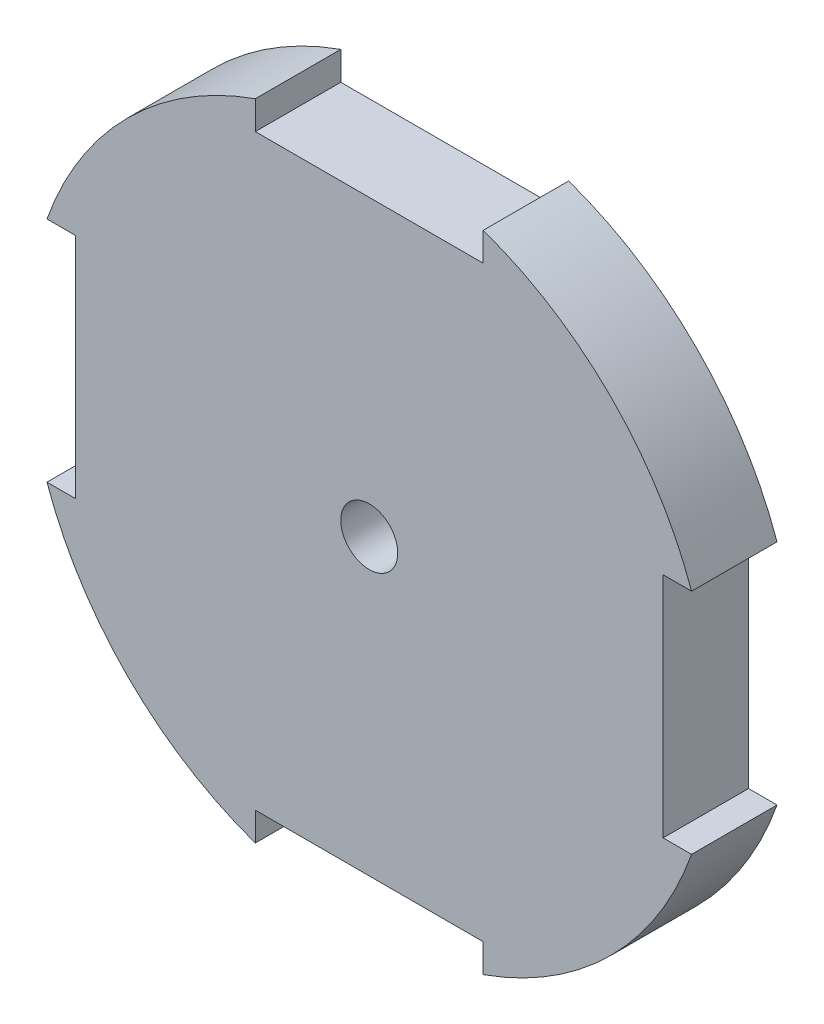
ISO-10303-21;
HEADER;
FILE_DESCRIPTION(('STEP AP214'),'2;1');
FILE_NAME('part.step','',(''),(''),'','','');
FILE_SCHEMA(('AUTOMOTIVE_DESIGN { 1 0 10303 214 1 1 1 1 }'));
ENDSEC;
DATA;
#1=APPLICATION_CONTEXT('core data for automotive mechanical design processes');
#2=APPLICATION_PROTOCOL_DEFINITION('international standard','automotive_design',2000,#1);
#3=PRODUCT_CONTEXT('',#1,'mechanical');
#4=PRODUCT('Part','Part','',(#3));
#5=PRODUCT_RELATED_PRODUCT_CATEGORY('part','',(#4));
#6=PRODUCT_DEFINITION_FORMATION('','',#4);
#7=PRODUCT_DEFINITION_CONTEXT('part definition',#1,'design');
#8=PRODUCT_DEFINITION('design','',#6,#7);
#9=PRODUCT_DEFINITION_SHAPE('','',#8);
#10=(LENGTH_UNIT() NAMED_UNIT(*) SI_UNIT(.MILLI.,.METRE.));
#11=(NAMED_UNIT(*) PLANE_ANGLE_UNIT() SI_UNIT($,.RADIAN.));
#12=(NAMED_UNIT(*) SI_UNIT($,.STERADIAN.) SOLID_ANGLE_UNIT());
#13=UNCERTAINTY_MEASURE_WITH_UNIT(LENGTH_MEASURE(1.E-05),#10,'distance_accuracy_value','');
#14=(GEOMETRIC_REPRESENTATION_CONTEXT(3) GLOBAL_UNCERTAINTY_ASSIGNED_CONTEXT((#13)) GLOBAL_UNIT_ASSIGNED_CONTEXT((#10,
#11,#12)) REPRESENTATION_CONTEXT('',''));
#15=CARTESIAN_POINT('',(0.,0.,0.));
#16=DIRECTION('',(0.,0.,1.));
#17=DIRECTION('',(1.,0.,0.));
#18=AXIS2_PLACEMENT_3D('',#15,#16,#17);
#19=CARTESIAN_POINT('',(-25.4,71.8420489685532,9.525));
#20=DIRECTION('',(1.,0.,0.));
#21=DIRECTION('',(0.,0.,-1.));
#22=AXIS2_PLACEMENT_3D('',#19,#20,#21);
#23=PLANE('',#22);
#24=DIRECTION('',(0.,-1.,0.));
#25=VECTOR('',#24,1.);
#26=CARTESIAN_POINT('',(-25.4,71.8420489685532,-9.525));
#27=LINE('',#26,#25);
#28=CARTESIAN_POINT('',(-25.4,71.8420489685532,-9.525));
#29=VERTEX_POINT('',#28);
#30=CARTESIAN_POINT('',(-25.4,65.4920489685532,-9.525));
#31=VERTEX_POINT('',#30);
#32=EDGE_CURVE('E190',#29,#31,#27,.T.);
#33=ORIENTED_EDGE('',*,*,#32,.F.);
#34=DIRECTION('',(0.,0.,-1.));
#35=VECTOR('',#34,1.);
#36=CARTESIAN_POINT('',(-25.4,71.8420489685532,9.525));
#37=LINE('',#36,#35);
#38=CARTESIAN_POINT('',(-25.4,71.8420489685532,9.525));
#39=VERTEX_POINT('',#38);
#40=EDGE_CURVE('E11',#39,#29,#37,.T.);
#41=ORIENTED_EDGE('',*,*,#40,.F.);
#42=DIRECTION('',(0.,-1.,0.));
#43=VECTOR('',#42,1.);
#44=CARTESIAN_POINT('',(-25.4,71.8420489685532,9.525));
#45=LINE('',#44,#43);
#46=CARTESIAN_POINT('',(-25.4,65.4920489685532,9.525));
#47=VERTEX_POINT('',#46);
#48=EDGE_CURVE('E234',#39,#47,#45,.T.);
#49=ORIENTED_EDGE('',*,*,#48,.T.);
#50=DIRECTION('',(0.,0.,-1.));
#51=VECTOR('',#50,1.);
#52=CARTESIAN_POINT('',(-25.4,65.4920489685532,9.525));
#53=LINE('',#52,#51);
#54=EDGE_CURVE('E47',#47,#31,#53,.T.);
#55=ORIENTED_EDGE('',*,*,#54,.T.);
#56=EDGE_LOOP('',(#33,#41,#49,#55));
#57=FACE_BOUND('',#56,.T.);
#58=ADVANCED_FACE('F44',(#57),#23,.T.);
#59=CARTESIAN_POINT('',(0.,0.,9.525));
#60=DIRECTION('',(0.,0.,-1.));
#61=DIRECTION('',(-1.,0.,0.));
#62=AXIS2_PLACEMENT_3D('',#59,#60,#61);
#63=CYLINDRICAL_SURFACE('',#62,76.2);
#64=CARTESIAN_POINT('',(0.,0.,-9.525));
#65=DIRECTION('',(0.,0.,1.));
#66=DIRECTION('',(1.,0.,0.));
#67=AXIS2_PLACEMENT_3D('',#64,#65,#66);
#68=CIRCLE('',#67,76.2);
#69=CARTESIAN_POINT('',(-71.842048968553,25.4000000000008,-9.525));
#70=VERTEX_POINT('',#69);
#71=EDGE_CURVE('E233',#29,#70,#68,.T.);
#72=ORIENTED_EDGE('',*,*,#71,.T.);
#73=DIRECTION('',(0.,0.,-1.));
#74=VECTOR('',#73,1.);
#75=CARTESIAN_POINT('',(-71.842048968553,25.4000000000008,9.525));
#76=LINE('',#75,#74);
#77=CARTESIAN_POINT('',(-71.842048968553,25.4000000000008,9.525));
#78=VERTEX_POINT('',#77);
#79=EDGE_CURVE('E53',#78,#70,#76,.T.);
#80=ORIENTED_EDGE('',*,*,#79,.F.);
#81=CARTESIAN_POINT('',(0.,0.,9.525));
#82=DIRECTION('',(0.,0.,1.));
#83=DIRECTION('',(1.,0.,0.));
#84=AXIS2_PLACEMENT_3D('',#81,#82,#83);
#85=CIRCLE('',#84,76.2);
#86=EDGE_CURVE('E180',#39,#78,#85,.T.);
#87=ORIENTED_EDGE('',*,*,#86,.F.);
#88=ORIENTED_EDGE('',*,*,#40,.T.);
#89=EDGE_LOOP('',(#72,#80,#87,#88));
#90=FACE_BOUND('',#89,.T.);
#91=ADVANCED_FACE('F262',(#90),#63,.T.);
#92=CARTESIAN_POINT('',(-65.492048968553,25.4000000000007,9.525));
#93=DIRECTION('',(0.,-1.,0.));
#94=DIRECTION('',(1.,0.,0.));
#95=AXIS2_PLACEMENT_3D('',#92,#93,#94);
#96=PLANE('',#95);
#97=DIRECTION('',(-1.,0.,0.));
#98=VECTOR('',#97,1.);
#99=CARTESIAN_POINT('',(-65.492048968553,25.4000000000007,-9.525));
#100=LINE('',#99,#98);
#101=CARTESIAN_POINT('',(-65.492048968553,25.4000000000007,-9.525));
#102=VERTEX_POINT('',#101);
#103=EDGE_CURVE('E166',#102,#70,#100,.T.);
#104=ORIENTED_EDGE('',*,*,#103,.F.);
#105=DIRECTION('',(0.,0.,-1.));
#106=VECTOR('',#105,1.);
#107=CARTESIAN_POINT('',(-65.492048968553,25.4000000000007,9.525));
#108=LINE('',#107,#106);
#109=CARTESIAN_POINT('',(-65.492048968553,25.4000000000007,9.525));
#110=VERTEX_POINT('',#109);
#111=EDGE_CURVE('E161',#110,#102,#108,.T.);
#112=ORIENTED_EDGE('',*,*,#111,.F.);
#113=DIRECTION('',(-1.,0.,0.));
#114=VECTOR('',#113,1.);
#115=CARTESIAN_POINT('',(-65.492048968553,25.4000000000007,9.525));
#116=LINE('',#115,#114);
#117=EDGE_CURVE('E164',#110,#78,#116,.T.);
#118=ORIENTED_EDGE('',*,*,#117,.T.);
#119=ORIENTED_EDGE('',*,*,#79,.T.);
#120=EDGE_LOOP('',(#104,#112,#118,#119));
#121=FACE_BOUND('',#120,.T.);
#122=ADVANCED_FACE('F163',(#121),#96,.T.);
#123=CARTESIAN_POINT('',(-65.4920489685535,-25.3999999999993,9.525));
#124=DIRECTION('',(-1.,0.,0.));
#125=DIRECTION('',(0.,-1.,0.));
#126=AXIS2_PLACEMENT_3D('',#123,#124,#125);
#127=PLANE('',#126);
#128=DIRECTION('',(0.,1.,0.));
#129=VECTOR('',#128,1.);
#130=CARTESIAN_POINT('',(-65.4920489685535,-25.3999999999993,-9.525));
#131=LINE('',#130,#129);
#132=CARTESIAN_POINT('',(-65.4920489685535,-25.3999999999993,-9.525));
#133=VERTEX_POINT('',#132);
#134=EDGE_CURVE('E230',#133,#102,#131,.T.);
#135=ORIENTED_EDGE('',*,*,#134,.F.);
#136=DIRECTION('',(0.,0.,-1.));
#137=VECTOR('',#136,1.);
#138=CARTESIAN_POINT('',(-65.4920489685535,-25.3999999999993,9.525));
#139=LINE('',#138,#137);
#140=CARTESIAN_POINT('',(-65.4920489685535,-25.3999999999993,9.525));
#141=VERTEX_POINT('',#140);
#142=EDGE_CURVE('E171',#141,#133,#139,.T.);
#143=ORIENTED_EDGE('',*,*,#142,.F.);
#144=DIRECTION('',(0.,1.,0.));
#145=VECTOR('',#144,1.);
#146=CARTESIAN_POINT('',(-65.4920489685535,-25.3999999999993,9.525));
#147=LINE('',#146,#145);
#148=EDGE_CURVE('E178',#141,#110,#147,.T.);
#149=ORIENTED_EDGE('',*,*,#148,.T.);
#150=ORIENTED_EDGE('',*,*,#111,.T.);
#151=EDGE_LOOP('',(#135,#143,#149,#150));
#152=FACE_BOUND('',#151,.T.);
#153=ADVANCED_FACE('F182',(#152),#127,.T.);
#154=CARTESIAN_POINT('',(-71.8420489685535,-25.3999999999992,9.525));
#155=DIRECTION('',(0.,1.,0.));
#156=DIRECTION('',(-1.,0.,0.));
#157=AXIS2_PLACEMENT_3D('',#154,#155,#156);
#158=PLANE('',#157);
#159=DIRECTION('',(1.,0.,0.));
#160=VECTOR('',#159,1.);
#161=CARTESIAN_POINT('',(-71.8420489685535,-25.3999999999992,-9.525));
#162=LINE('',#161,#160);
#163=CARTESIAN_POINT('',(-71.8420489685535,-25.3999999999992,-9.525));
#164=VERTEX_POINT('',#163);
#165=EDGE_CURVE('E227',#164,#133,#162,.T.);
#166=ORIENTED_EDGE('',*,*,#165,.F.);
#167=DIRECTION('',(0.,0.,-1.));
#168=VECTOR('',#167,1.);
#169=CARTESIAN_POINT('',(-71.8420489685535,-25.3999999999992,9.525));
#170=LINE('',#169,#168);
#171=CARTESIAN_POINT('',(-71.8420489685535,-25.3999999999992,9.525));
#172=VERTEX_POINT('',#171);
#173=EDGE_CURVE('E238',#172,#164,#170,.T.);
#174=ORIENTED_EDGE('',*,*,#173,.F.);
#175=DIRECTION('',(1.,0.,0.));
#176=VECTOR('',#175,1.);
#177=CARTESIAN_POINT('',(-71.8420489685535,-25.3999999999992,9.525));
#178=LINE('',#177,#176);
#179=EDGE_CURVE('E183',#172,#141,#178,.T.);
#180=ORIENTED_EDGE('',*,*,#179,.T.);
#181=ORIENTED_EDGE('',*,*,#142,.T.);
#182=EDGE_LOOP('',(#166,#174,#180,#181));
#183=FACE_BOUND('',#182,.T.);
#184=ADVANCED_FACE('F358',(#183),#158,.T.);
#185=CARTESIAN_POINT('',(0.,0.,9.525));
#186=DIRECTION('',(0.,0.,-1.));
#187=DIRECTION('',(-1.,0.,0.));
#188=AXIS2_PLACEMENT_3D('',#185,#186,#187);
#189=CYLINDRICAL_SURFACE('',#188,76.2);
#190=CARTESIAN_POINT('',(0.,0.,-9.525));
#191=DIRECTION('',(0.,0.,1.));
#192=DIRECTION('',(1.,0.,0.));
#193=AXIS2_PLACEMENT_3D('',#190,#191,#192);
#194=CIRCLE('',#193,76.2);
#195=CARTESIAN_POINT('',(-25.4000000000005,-71.8420489685531,-9.525));
#196=VERTEX_POINT('',#195);
#197=EDGE_CURVE('E224',#164,#196,#194,.T.);
#198=ORIENTED_EDGE('',*,*,#197,.T.);
#199=DIRECTION('',(0.,0.,-1.));
#200=VECTOR('',#199,1.);
#201=CARTESIAN_POINT('',(-25.4000000000005,-71.8420489685531,9.525));
#202=LINE('',#201,#200);
#203=CARTESIAN_POINT('',(-25.4000000000005,-71.8420489685531,9.525));
#204=VERTEX_POINT('',#203);
#205=EDGE_CURVE('E240',#204,#196,#202,.T.);
#206=ORIENTED_EDGE('',*,*,#205,.F.);
#207=CARTESIAN_POINT('',(0.,0.,9.525));
#208=DIRECTION('',(0.,0.,1.));
#209=DIRECTION('',(1.,0.,0.));
#210=AXIS2_PLACEMENT_3D('',#207,#208,#209);
#211=CIRCLE('',#210,76.2);
#212=EDGE_CURVE('E185',#172,#204,#211,.T.);
#213=ORIENTED_EDGE('',*,*,#212,.F.);
#214=ORIENTED_EDGE('',*,*,#173,.T.);
#215=EDGE_LOOP('',(#198,#206,#213,#214));
#216=FACE_BOUND('',#215,.T.);
#217=ADVANCED_FACE('F300',(#216),#189,.T.);
#218=CARTESIAN_POINT('',(-25.4000000000005,-65.4920489685531,9.525));
#219=DIRECTION('',(1.,0.,0.));
#220=DIRECTION('',(0.,1.,0.));
#221=AXIS2_PLACEMENT_3D('',#218,#219,#220);
#222=PLANE('',#221);
#223=DIRECTION('',(0.,-1.,0.));
#224=VECTOR('',#223,1.);
#225=CARTESIAN_POINT('',(-25.4000000000005,-65.4920489685531,-9.525));
#226=LINE('',#225,#224);
#227=CARTESIAN_POINT('',(-25.4000000000005,-65.4920489685531,-9.525));
#228=VERTEX_POINT('',#227);
#229=EDGE_CURVE('E221',#228,#196,#226,.T.);
#230=ORIENTED_EDGE('',*,*,#229,.F.);
#231=DIRECTION('',(0.,0.,-1.));
#232=VECTOR('',#231,1.);
#233=CARTESIAN_POINT('',(-25.4000000000005,-65.4920489685531,9.525));
#234=LINE('',#233,#232);
#235=CARTESIAN_POINT('',(-25.4000000000005,-65.4920489685531,9.525));
#236=VERTEX_POINT('',#235);
#237=EDGE_CURVE('E242',#236,#228,#234,.T.);
#238=ORIENTED_EDGE('',*,*,#237,.F.);
#239=DIRECTION('',(0.,-1.,0.));
#240=VECTOR('',#239,1.);
#241=CARTESIAN_POINT('',(-25.4000000000005,-65.4920489685531,9.525));
#242=LINE('',#241,#240);
#243=EDGE_CURVE('E293',#236,#204,#242,.T.);
#244=ORIENTED_EDGE('',*,*,#243,.T.);
#245=ORIENTED_EDGE('',*,*,#205,.T.);
#246=EDGE_LOOP('',(#230,#238,#244,#245));
#247=FACE_BOUND('',#246,.T.);
#248=ADVANCED_FACE('F304',(#247),#222,.T.);
#249=CARTESIAN_POINT('',(25.3999999999995,-65.4920489685534,9.525));
#250=DIRECTION('',(0.,-1.,0.));
#251=DIRECTION('',(1.,0.,0.));
#252=AXIS2_PLACEMENT_3D('',#249,#250,#251);
#253=PLANE('',#252);
#254=DIRECTION('',(-1.,0.,0.));
#255=VECTOR('',#254,1.);
#256=CARTESIAN_POINT('',(25.3999999999995,-65.4920489685534,-9.525));
#257=LINE('',#256,#255);
#258=CARTESIAN_POINT('',(25.3999999999995,-65.4920489685534,-9.525));
#259=VERTEX_POINT('',#258);
#260=EDGE_CURVE('E218',#259,#228,#257,.T.);
#261=ORIENTED_EDGE('',*,*,#260,.F.);
#262=DIRECTION('',(0.,0.,-1.));
#263=VECTOR('',#262,1.);
#264=CARTESIAN_POINT('',(25.3999999999995,-65.4920489685534,9.525));
#265=LINE('',#264,#263);
#266=CARTESIAN_POINT('',(25.3999999999995,-65.4920489685534,9.525));
#267=VERTEX_POINT('',#266);
#268=EDGE_CURVE('E244',#267,#259,#265,.T.);
#269=ORIENTED_EDGE('',*,*,#268,.F.);
#270=DIRECTION('',(-1.,0.,0.));
#271=VECTOR('',#270,1.);
#272=CARTESIAN_POINT('',(25.3999999999995,-65.4920489685534,9.525));
#273=LINE('',#272,#271);
#274=EDGE_CURVE('E290',#267,#236,#273,.T.);
#275=ORIENTED_EDGE('',*,*,#274,.T.);
#276=ORIENTED_EDGE('',*,*,#237,.T.);
#277=EDGE_LOOP('',(#261,#269,#275,#276));
#278=FACE_BOUND('',#277,.T.);
#279=ADVANCED_FACE('F307',(#278),#253,.T.);
#280=CARTESIAN_POINT('',(25.3999999999995,-71.8420489685534,9.525));
#281=DIRECTION('',(-1.,0.,0.));
#282=DIRECTION('',(0.,-1.,0.));
#283=AXIS2_PLACEMENT_3D('',#280,#281,#282);
#284=PLANE('',#283);
#285=DIRECTION('',(0.,1.,0.));
#286=VECTOR('',#285,1.);
#287=CARTESIAN_POINT('',(25.3999999999995,-71.8420489685534,-9.525));
#288=LINE('',#287,#286);
#289=CARTESIAN_POINT('',(25.3999999999995,-71.8420489685534,-9.525));
#290=VERTEX_POINT('',#289);
#291=EDGE_CURVE('E215',#290,#259,#288,.T.);
#292=ORIENTED_EDGE('',*,*,#291,.F.);
#293=DIRECTION('',(0.,0.,-1.));
#294=VECTOR('',#293,1.);
#295=CARTESIAN_POINT('',(25.3999999999995,-71.8420489685534,9.525));
#296=LINE('',#295,#294);
#297=CARTESIAN_POINT('',(25.3999999999995,-71.8420489685534,9.525));
#298=VERTEX_POINT('',#297);
#299=EDGE_CURVE('E246',#298,#290,#296,.T.);
#300=ORIENTED_EDGE('',*,*,#299,.F.);
#301=DIRECTION('',(0.,1.,0.));
#302=VECTOR('',#301,1.);
#303=CARTESIAN_POINT('',(25.3999999999995,-71.8420489685534,9.525));
#304=LINE('',#303,#302);
#305=EDGE_CURVE('E287',#298,#267,#304,.T.);
#306=ORIENTED_EDGE('',*,*,#305,.T.);
#307=ORIENTED_EDGE('',*,*,#268,.T.);
#308=EDGE_LOOP('',(#292,#300,#306,#307));
#309=FACE_BOUND('',#308,.T.);
#310=ADVANCED_FACE('F311',(#309),#284,.T.);
#311=CARTESIAN_POINT('',(0.,0.,9.525));
#312=DIRECTION('',(0.,0.,-1.));
#313=DIRECTION('',(-1.,0.,0.));
#314=AXIS2_PLACEMENT_3D('',#311,#312,#313);
#315=CYLINDRICAL_SURFACE('',#314,76.2);
#316=CARTESIAN_POINT('',(0.,0.,-9.525));
#317=DIRECTION('',(0.,0.,1.));
#318=DIRECTION('',(1.,0.,0.));
#319=AXIS2_PLACEMENT_3D('',#316,#317,#318);
#320=CIRCLE('',#319,76.2);
#321=CARTESIAN_POINT('',(71.8420489685531,-25.4000000000003,-9.525));
#322=VERTEX_POINT('',#321);
#323=EDGE_CURVE('E212',#290,#322,#320,.T.);
#324=ORIENTED_EDGE('',*,*,#323,.T.);
#325=DIRECTION('',(0.,0.,-1.));
#326=VECTOR('',#325,1.);
#327=CARTESIAN_POINT('',(71.8420489685531,-25.4000000000003,9.525));
#328=LINE('',#327,#326);
#329=CARTESIAN_POINT('',(71.8420489685531,-25.4000000000003,9.525));
#330=VERTEX_POINT('',#329);
#331=EDGE_CURVE('E248',#330,#322,#328,.T.);
#332=ORIENTED_EDGE('',*,*,#331,.F.);
#333=CARTESIAN_POINT('',(0.,0.,9.525));
#334=DIRECTION('',(0.,0.,1.));
#335=DIRECTION('',(1.,0.,0.));
#336=AXIS2_PLACEMENT_3D('',#333,#334,#335);
#337=CIRCLE('',#336,76.2);
#338=EDGE_CURVE('E285',#298,#330,#337,.T.);
#339=ORIENTED_EDGE('',*,*,#338,.F.);
#340=ORIENTED_EDGE('',*,*,#299,.T.);
#341=EDGE_LOOP('',(#324,#332,#339,#340));
#342=FACE_BOUND('',#341,.T.);
#343=ADVANCED_FACE('F316',(#342),#315,.T.);
#344=CARTESIAN_POINT('',(65.4920489685531,-25.4000000000002,9.525));
#345=DIRECTION('',(0.,1.,0.));
#346=DIRECTION('',(-1.,0.,0.));
#347=AXIS2_PLACEMENT_3D('',#344,#345,#346);
#348=PLANE('',#347);
#349=DIRECTION('',(1.,0.,0.));
#350=VECTOR('',#349,1.);
#351=CARTESIAN_POINT('',(65.4920489685531,-25.4000000000002,-9.525));
#352=LINE('',#351,#350);
#353=CARTESIAN_POINT('',(65.4920489685531,-25.4000000000002,-9.525));
#354=VERTEX_POINT('',#353);
#355=EDGE_CURVE('E209',#354,#322,#352,.T.);
#356=ORIENTED_EDGE('',*,*,#355,.F.);
#357=DIRECTION('',(0.,0.,-1.));
#358=VECTOR('',#357,1.);
#359=CARTESIAN_POINT('',(65.4920489685531,-25.4000000000002,9.525));
#360=LINE('',#359,#358);
#361=CARTESIAN_POINT('',(65.4920489685531,-25.4000000000002,9.525));
#362=VERTEX_POINT('',#361);
#363=EDGE_CURVE('E250',#362,#354,#360,.T.);
#364=ORIENTED_EDGE('',*,*,#363,.F.);
#365=DIRECTION('',(1.,0.,0.));
#366=VECTOR('',#365,1.);
#367=CARTESIAN_POINT('',(65.4920489685531,-25.4000000000002,9.525));
#368=LINE('',#367,#366);
#369=EDGE_CURVE('E282',#362,#330,#368,.T.);
#370=ORIENTED_EDGE('',*,*,#369,.T.);
#371=ORIENTED_EDGE('',*,*,#331,.T.);
#372=EDGE_LOOP('',(#356,#364,#370,#371));
#373=FACE_BOUND('',#372,.T.);
#374=ADVANCED_FACE('F335',(#373),#348,.T.);
#375=CARTESIAN_POINT('',(65.4920489685533,25.3999999999998,9.525));
#376=DIRECTION('',(1.,0.,0.));
#377=DIRECTION('',(0.,1.,0.));
#378=AXIS2_PLACEMENT_3D('',#375,#376,#377);
#379=PLANE('',#378);
#380=DIRECTION('',(0.,-1.,0.));
#381=VECTOR('',#380,1.);
#382=CARTESIAN_POINT('',(65.4920489685533,25.3999999999998,-9.525));
#383=LINE('',#382,#381);
#384=CARTESIAN_POINT('',(65.4920489685533,25.3999999999998,-9.525));
#385=VERTEX_POINT('',#384);
#386=EDGE_CURVE('E206',#385,#354,#383,.T.);
#387=ORIENTED_EDGE('',*,*,#386,.F.);
#388=DIRECTION('',(0.,0.,-1.));
#389=VECTOR('',#388,1.);
#390=CARTESIAN_POINT('',(65.4920489685533,25.3999999999998,9.525));
#391=LINE('',#390,#389);
#392=CARTESIAN_POINT('',(65.4920489685533,25.3999999999998,9.525));
#393=VERTEX_POINT('',#392);
#394=EDGE_CURVE('E252',#393,#385,#391,.T.);
#395=ORIENTED_EDGE('',*,*,#394,.F.);
#396=DIRECTION('',(0.,-1.,0.));
#397=VECTOR('',#396,1.);
#398=CARTESIAN_POINT('',(65.4920489685533,25.3999999999998,9.525));
#399=LINE('',#398,#397);
#400=EDGE_CURVE('E279',#393,#362,#399,.T.);
#401=ORIENTED_EDGE('',*,*,#400,.T.);
#402=ORIENTED_EDGE('',*,*,#363,.T.);
#403=EDGE_LOOP('',(#387,#395,#401,#402));
#404=FACE_BOUND('',#403,.T.);
#405=ADVANCED_FACE('F323',(#404),#379,.T.);
#406=CARTESIAN_POINT('',(71.8420489685533,25.3999999999997,9.525));
#407=DIRECTION('',(0.,-1.,0.));
#408=DIRECTION('',(1.,0.,0.));
#409=AXIS2_PLACEMENT_3D('',#406,#407,#408);
#410=PLANE('',#409);
#411=DIRECTION('',(-1.,0.,0.));
#412=VECTOR('',#411,1.);
#413=CARTESIAN_POINT('',(71.8420489685533,25.3999999999997,-9.525));
#414=LINE('',#413,#412);
#415=CARTESIAN_POINT('',(71.8420489685533,25.3999999999997,-9.525));
#416=VERTEX_POINT('',#415);
#417=EDGE_CURVE('E203',#416,#385,#414,.T.);
#418=ORIENTED_EDGE('',*,*,#417,.F.);
#419=DIRECTION('',(0.,0.,-1.));
#420=VECTOR('',#419,1.);
#421=CARTESIAN_POINT('',(71.8420489685533,25.3999999999997,9.525));
#422=LINE('',#421,#420);
#423=CARTESIAN_POINT('',(71.8420489685533,25.3999999999997,9.525));
#424=VERTEX_POINT('',#423);
#425=EDGE_CURVE('E254',#424,#416,#422,.T.);
#426=ORIENTED_EDGE('',*,*,#425,.F.);
#427=DIRECTION('',(-1.,0.,0.));
#428=VECTOR('',#427,1.);
#429=CARTESIAN_POINT('',(71.8420489685533,25.3999999999997,9.525));
#430=LINE('',#429,#428);
#431=EDGE_CURVE('E276',#424,#393,#430,.T.);
#432=ORIENTED_EDGE('',*,*,#431,.T.);
#433=ORIENTED_EDGE('',*,*,#394,.T.);
#434=EDGE_LOOP('',(#418,#426,#432,#433));
#435=FACE_BOUND('',#434,.T.);
#436=ADVANCED_FACE('F327',(#435),#410,.T.);
#437=CARTESIAN_POINT('',(0.,0.,9.525));
#438=DIRECTION('',(0.,0.,-1.));
#439=DIRECTION('',(-1.,0.,0.));
#440=AXIS2_PLACEMENT_3D('',#437,#438,#439);
#441=CYLINDRICAL_SURFACE('',#440,76.2);
#442=CARTESIAN_POINT('',(0.,0.,-9.525));
#443=DIRECTION('',(0.,0.,1.));
#444=DIRECTION('',(1.,0.,0.));
#445=AXIS2_PLACEMENT_3D('',#442,#443,#444);
#446=CIRCLE('',#445,76.2);
#447=CARTESIAN_POINT('',(25.4,71.8420489685532,-9.525));
#448=VERTEX_POINT('',#447);
#449=EDGE_CURVE('E200',#416,#448,#446,.T.);
#450=ORIENTED_EDGE('',*,*,#449,.T.);
#451=DIRECTION('',(0.,0.,-1.));
#452=VECTOR('',#451,1.);
#453=CARTESIAN_POINT('',(25.4,71.8420489685532,9.525));
#454=LINE('',#453,#452);
#455=CARTESIAN_POINT('',(25.4,71.8420489685532,9.525));
#456=VERTEX_POINT('',#455);
#457=EDGE_CURVE('E256',#456,#448,#454,.T.);
#458=ORIENTED_EDGE('',*,*,#457,.F.);
#459=CARTESIAN_POINT('',(0.,0.,9.525));
#460=DIRECTION('',(0.,0.,1.));
#461=DIRECTION('',(1.,0.,0.));
#462=AXIS2_PLACEMENT_3D('',#459,#460,#461);
#463=CIRCLE('',#462,76.2);
#464=EDGE_CURVE('E274',#424,#456,#463,.T.);
#465=ORIENTED_EDGE('',*,*,#464,.F.);
#466=ORIENTED_EDGE('',*,*,#425,.T.);
#467=EDGE_LOOP('',(#450,#458,#465,#466));
#468=FACE_BOUND('',#467,.T.);
#469=ADVANCED_FACE('F331',(#468),#441,.T.);
#470=CARTESIAN_POINT('',(25.4,65.4920489685532,9.525));
#471=DIRECTION('',(-1.,0.,0.));
#472=DIRECTION('',(0.,0.,1.));
#473=AXIS2_PLACEMENT_3D('',#470,#471,#472);
#474=PLANE('',#473);
#475=DIRECTION('',(0.,1.,0.));
#476=VECTOR('',#475,1.);
#477=CARTESIAN_POINT('',(25.4,65.4920489685532,-9.525));
#478=LINE('',#477,#476);
#479=CARTESIAN_POINT('',(25.4,65.4920489685532,-9.525));
#480=VERTEX_POINT('',#479);
#481=EDGE_CURVE('E197',#480,#448,#478,.T.);
#482=ORIENTED_EDGE('',*,*,#481,.F.);
#483=DIRECTION('',(0.,0.,-1.));
#484=VECTOR('',#483,1.);
#485=CARTESIAN_POINT('',(25.4,65.4920489685532,9.525));
#486=LINE('',#485,#484);
#487=CARTESIAN_POINT('',(25.4,65.4920489685532,9.525));
#488=VERTEX_POINT('',#487);
#489=EDGE_CURVE('E257',#488,#480,#486,.T.);
#490=ORIENTED_EDGE('',*,*,#489,.F.);
#491=DIRECTION('',(0.,1.,0.));
#492=VECTOR('',#491,1.);
#493=CARTESIAN_POINT('',(25.4,65.4920489685532,9.525));
#494=LINE('',#493,#492);
#495=EDGE_CURVE('E266',#488,#456,#494,.T.);
#496=ORIENTED_EDGE('',*,*,#495,.T.);
#497=ORIENTED_EDGE('',*,*,#457,.T.);
#498=EDGE_LOOP('',(#482,#490,#496,#497));
#499=FACE_BOUND('',#498,.T.);
#500=ADVANCED_FACE('F334',(#499),#474,.T.);
#501=CARTESIAN_POINT('',(-25.4,65.4920489685532,9.525));
#502=DIRECTION('',(0.,1.,0.));
#503=DIRECTION('',(0.,0.,1.));
#504=AXIS2_PLACEMENT_3D('',#501,#502,#503);
#505=PLANE('',#504);
#506=DIRECTION('',(1.,0.,0.));
#507=VECTOR('',#506,1.);
#508=CARTESIAN_POINT('',(-25.4,65.4920489685532,-9.525));
#509=LINE('',#508,#507);
#510=EDGE_CURVE('E193',#31,#480,#509,.T.);
#511=ORIENTED_EDGE('',*,*,#510,.F.);
#512=ORIENTED_EDGE('',*,*,#54,.F.);
#513=DIRECTION('',(1.,0.,0.));
#514=VECTOR('',#513,1.);
#515=CARTESIAN_POINT('',(-25.4,65.4920489685532,9.525));
#516=LINE('',#515,#514);
#517=EDGE_CURVE('E264',#47,#488,#516,.T.);
#518=ORIENTED_EDGE('',*,*,#517,.T.);
#519=ORIENTED_EDGE('',*,*,#489,.T.);
#520=EDGE_LOOP('',(#511,#512,#518,#519));
#521=FACE_BOUND('',#520,.T.);
#522=ADVANCED_FACE('F259',(#521),#505,.T.);
#523=CARTESIAN_POINT('',(0.,0.,9.525));
#524=DIRECTION('',(0.,0.,1.));
#525=DIRECTION('',(1.,0.,0.));
#526=AXIS2_PLACEMENT_3D('',#523,#524,#525);
#527=PLANE('',#526);
#528=CARTESIAN_POINT('',(0.,0.,9.525));
#529=DIRECTION('',(0.,0.,1.));
#530=DIRECTION('',(1.,0.,0.));
#531=AXIS2_PLACEMENT_3D('',#528,#529,#530);
#532=CIRCLE('',#531,6.35);
#533=CARTESIAN_POINT('',(6.35,0.,9.525));
#534=VERTEX_POINT('',#533);
#535=EDGE_CURVE('E269',#534,#534,#532,.T.);
#536=ORIENTED_EDGE('',*,*,#535,.F.);
#537=EDGE_LOOP('',(#536));
#538=FACE_BOUND('',#537,.T.);
#539=ORIENTED_EDGE('',*,*,#48,.F.);
#540=ORIENTED_EDGE('',*,*,#86,.T.);
#541=ORIENTED_EDGE('',*,*,#117,.F.);
#542=ORIENTED_EDGE('',*,*,#148,.F.);
#543=ORIENTED_EDGE('',*,*,#179,.F.);
#544=ORIENTED_EDGE('',*,*,#212,.T.);
#545=ORIENTED_EDGE('',*,*,#243,.F.);
#546=ORIENTED_EDGE('',*,*,#274,.F.);
#547=ORIENTED_EDGE('',*,*,#305,.F.);
#548=ORIENTED_EDGE('',*,*,#338,.T.);
#549=ORIENTED_EDGE('',*,*,#369,.F.);
#550=ORIENTED_EDGE('',*,*,#400,.F.);
#551=ORIENTED_EDGE('',*,*,#431,.F.);
#552=ORIENTED_EDGE('',*,*,#464,.T.);
#553=ORIENTED_EDGE('',*,*,#495,.F.);
#554=ORIENTED_EDGE('',*,*,#517,.F.);
#555=EDGE_LOOP('',(#539,#540,#541,#542,#543,#544,#545,#546,#547,#548,#549,#550,#551,#552,#553,#554));
#556=FACE_BOUND('',#555,.T.);
#557=ADVANCED_FACE('F176',(#538,#556),#527,.T.);
#558=CARTESIAN_POINT('',(0.,0.,-9.525));
#559=DIRECTION('',(0.,0.,1.));
#560=DIRECTION('',(1.,0.,0.));
#561=AXIS2_PLACEMENT_3D('',#558,#559,#560);
#562=PLANE('',#561);
#563=CARTESIAN_POINT('',(0.,0.,-9.525));
#564=DIRECTION('',(0.,0.,1.));
#565=DIRECTION('',(1.,0.,0.));
#566=AXIS2_PLACEMENT_3D('',#563,#564,#565);
#567=CIRCLE('',#566,6.35);
#568=CARTESIAN_POINT('',(6.35,0.,-9.525));
#569=VERTEX_POINT('',#568);
#570=EDGE_CURVE('E194',#569,#569,#567,.T.);
#571=ORIENTED_EDGE('',*,*,#570,.T.);
#572=EDGE_LOOP('',(#571));
#573=FACE_BOUND('',#572,.T.);
#574=ORIENTED_EDGE('',*,*,#32,.T.);
#575=ORIENTED_EDGE('',*,*,#510,.T.);
#576=ORIENTED_EDGE('',*,*,#481,.T.);
#577=ORIENTED_EDGE('',*,*,#449,.F.);
#578=ORIENTED_EDGE('',*,*,#417,.T.);
#579=ORIENTED_EDGE('',*,*,#386,.T.);
#580=ORIENTED_EDGE('',*,*,#355,.T.);
#581=ORIENTED_EDGE('',*,*,#323,.F.);
#582=ORIENTED_EDGE('',*,*,#291,.T.);
#583=ORIENTED_EDGE('',*,*,#260,.T.);
#584=ORIENTED_EDGE('',*,*,#229,.T.);
#585=ORIENTED_EDGE('',*,*,#197,.F.);
#586=ORIENTED_EDGE('',*,*,#165,.T.);
#587=ORIENTED_EDGE('',*,*,#134,.T.);
#588=ORIENTED_EDGE('',*,*,#103,.T.);
#589=ORIENTED_EDGE('',*,*,#71,.F.);
#590=EDGE_LOOP('',(#574,#575,#576,#577,#578,#579,#580,#581,#582,#583,#584,#585,#586,#587,#588,#589));
#591=FACE_BOUND('',#590,.T.);
#592=ADVANCED_FACE('F261',(#573,#591),#562,.F.);
#593=CARTESIAN_POINT('',(0.,0.,-9.525));
#594=DIRECTION('',(0.,0.,1.));
#595=DIRECTION('',(1.,0.,0.));
#596=AXIS2_PLACEMENT_3D('',#593,#594,#595);
#597=CYLINDRICAL_SURFACE('',#596,6.35);
#598=CARTESIAN_POINT('',(6.35,0.,-9.525));
#599=CARTESIAN_POINT('',(6.35,0.,-9.3265625));
#600=CARTESIAN_POINT('',(6.35,0.,-9.128125));
#601=CARTESIAN_POINT('',(6.35,0.,-8.73125));
#602=CARTESIAN_POINT('',(6.35,0.,-8.5328125));
#603=CARTESIAN_POINT('',(6.35,0.,-8.1359375));
#604=CARTESIAN_POINT('',(6.35,0.,-7.9375));
#605=CARTESIAN_POINT('',(6.35,0.,-7.540625));
#606=CARTESIAN_POINT('',(6.35,0.,-7.3421875));
#607=CARTESIAN_POINT('',(6.35,0.,-6.9453125));
#608=CARTESIAN_POINT('',(6.35,0.,-6.746875));
#609=CARTESIAN_POINT('',(6.35,0.,-6.35));
#610=CARTESIAN_POINT('',(6.35,0.,-6.1515625));
#611=CARTESIAN_POINT('',(6.35,0.,-5.7546875));
#612=CARTESIAN_POINT('',(6.35,0.,-5.55625));
#613=CARTESIAN_POINT('',(6.35,0.,-5.159375));
#614=CARTESIAN_POINT('',(6.35,0.,-4.9609375));
#615=CARTESIAN_POINT('',(6.35,0.,-4.5640625));
#616=CARTESIAN_POINT('',(6.35,0.,-4.365625));
#617=CARTESIAN_POINT('',(6.35,0.,-3.96875));
#618=CARTESIAN_POINT('',(6.35,0.,-3.7703125));
#619=CARTESIAN_POINT('',(6.35,0.,-3.3734375));
#620=CARTESIAN_POINT('',(6.35,0.,-3.175));
#621=CARTESIAN_POINT('',(6.35,0.,-2.778125));
#622=CARTESIAN_POINT('',(6.35,0.,-2.5796875));
#623=CARTESIAN_POINT('',(6.35,0.,-2.1828125));
#624=CARTESIAN_POINT('',(6.35,0.,-1.984375));
#625=CARTESIAN_POINT('',(6.35,0.,-1.5875));
#626=CARTESIAN_POINT('',(6.35,0.,-1.3890625));
#627=CARTESIAN_POINT('',(6.35,0.,-0.992187500000001));
#628=CARTESIAN_POINT('',(6.35,0.,-0.793750000000001));
#629=CARTESIAN_POINT('',(6.35,0.,-0.396875));
#630=CARTESIAN_POINT('',(6.35,0.,-0.1984375));
#631=CARTESIAN_POINT('',(6.35,0.,0.1984375));
#632=CARTESIAN_POINT('',(6.35,0.,0.396875));
#633=CARTESIAN_POINT('',(6.35,0.,0.793750000000001));
#634=CARTESIAN_POINT('',(6.35,0.,0.992187500000001));
#635=CARTESIAN_POINT('',(6.35,0.,1.3890625));
#636=CARTESIAN_POINT('',(6.35,0.,1.5875));
#637=CARTESIAN_POINT('',(6.35,0.,1.984375));
#638=CARTESIAN_POINT('',(6.35,0.,2.1828125));
#639=CARTESIAN_POINT('',(6.35,0.,2.5796875));
#640=CARTESIAN_POINT('',(6.35,0.,2.778125));
#641=CARTESIAN_POINT('',(6.35,0.,3.175));
#642=CARTESIAN_POINT('',(6.35,0.,3.3734375));
#643=CARTESIAN_POINT('',(6.35,0.,3.7703125));
#644=CARTESIAN_POINT('',(6.35,0.,3.96875));
#645=CARTESIAN_POINT('',(6.35,0.,4.365625));
#646=CARTESIAN_POINT('',(6.35,0.,4.5640625));
#647=CARTESIAN_POINT('',(6.35,0.,4.9609375));
#648=CARTESIAN_POINT('',(6.35,0.,5.159375));
#649=CARTESIAN_POINT('',(6.35,0.,5.55625));
#650=CARTESIAN_POINT('',(6.35,0.,5.7546875));
#651=CARTESIAN_POINT('',(6.35,0.,6.1515625));
#652=CARTESIAN_POINT('',(6.35,0.,6.35));
#653=CARTESIAN_POINT('',(6.35,0.,6.746875));
#654=CARTESIAN_POINT('',(6.35,0.,6.9453125));
#655=CARTESIAN_POINT('',(6.35,0.,7.3421875));
#656=CARTESIAN_POINT('',(6.35,0.,7.540625));
#657=CARTESIAN_POINT('',(6.35,0.,7.9375));
#658=CARTESIAN_POINT('',(6.35,0.,8.1359375));
#659=CARTESIAN_POINT('',(6.35,0.,8.5328125));
#660=CARTESIAN_POINT('',(6.35,0.,8.73125));
#661=CARTESIAN_POINT('',(6.35,0.,9.128125));
#662=CARTESIAN_POINT('',(6.35,0.,9.3265625));
#663=CARTESIAN_POINT('',(6.35,0.,9.525));
#664=B_SPLINE_CURVE_WITH_KNOTS('',3,(#598,#599,#600,#601,#602,#603,#604,#605,#606,#607,#608,
#609,#610,#611,#612,#613,#614,#615,#616,#617,#618,#619,#620,#621,#622,#623,#624,#625,#626,#627,
#628,#629,#630,#631,#632,#633,#634,#635,#636,#637,#638,#639,#640,#641,#642,#643,#644,#645,#646,
#647,#648,#649,#650,#651,#652,#653,#654,#655,#656,#657,#658,#659,#660,#661,#662,#663),
.UNSPECIFIED.,.F.,.F.,(4,2,2,2,2,2,2,2,2,2,2,2,2,2,2,2,2,2,2,2,2,2,2,2,2,2,2,2,2,2,2,2,4),(0.,
0.595312499999999,1.190625,1.7859375,2.38125,2.9765625,3.571875,4.1671875,4.7625,5.3578125,
5.953125,6.5484375,7.14375,7.7390625,8.334375,8.9296875,9.525,10.1203125,10.715625,11.3109375,
11.90625,12.5015625,13.096875,13.6921875,14.2875,14.8828125,15.478125,16.0734375,16.66875,
17.2640625,17.859375,18.4546875,19.05),.UNSPECIFIED.);
#665=EDGE_CURVE('BSEAM437',#569,#534,#664,.T.);
#666=ORIENTED_EDGE('',*,*,#570,.F.);
#667=ORIENTED_EDGE('',*,*,#535,.T.);
#668=ORIENTED_EDGE('',*,*,#665,.T.);
#669=ORIENTED_EDGE('',*,*,#665,.F.);
#670=EDGE_LOOP('',(#666,#668,#667,#669));
#671=FACE_BOUND('',#670,.T.);
#672=ADVANCED_FACE('F437',(#671),#597,.F.);
#673=CLOSED_SHELL('',(#58,#91,#122,#153,#184,#217,#248,#279,#310,#343,#374,#405,#436,#469,#500,
#522,#557,#592,#672));
#674=MANIFOLD_SOLID_BREP('B2',#673);
#675=ADVANCED_BREP_SHAPE_REPRESENTATION('',(#18,#674),#14);
#676=SHAPE_DEFINITION_REPRESENTATION(#9,#675);
ENDSEC;
END-ISO-10303-21;
